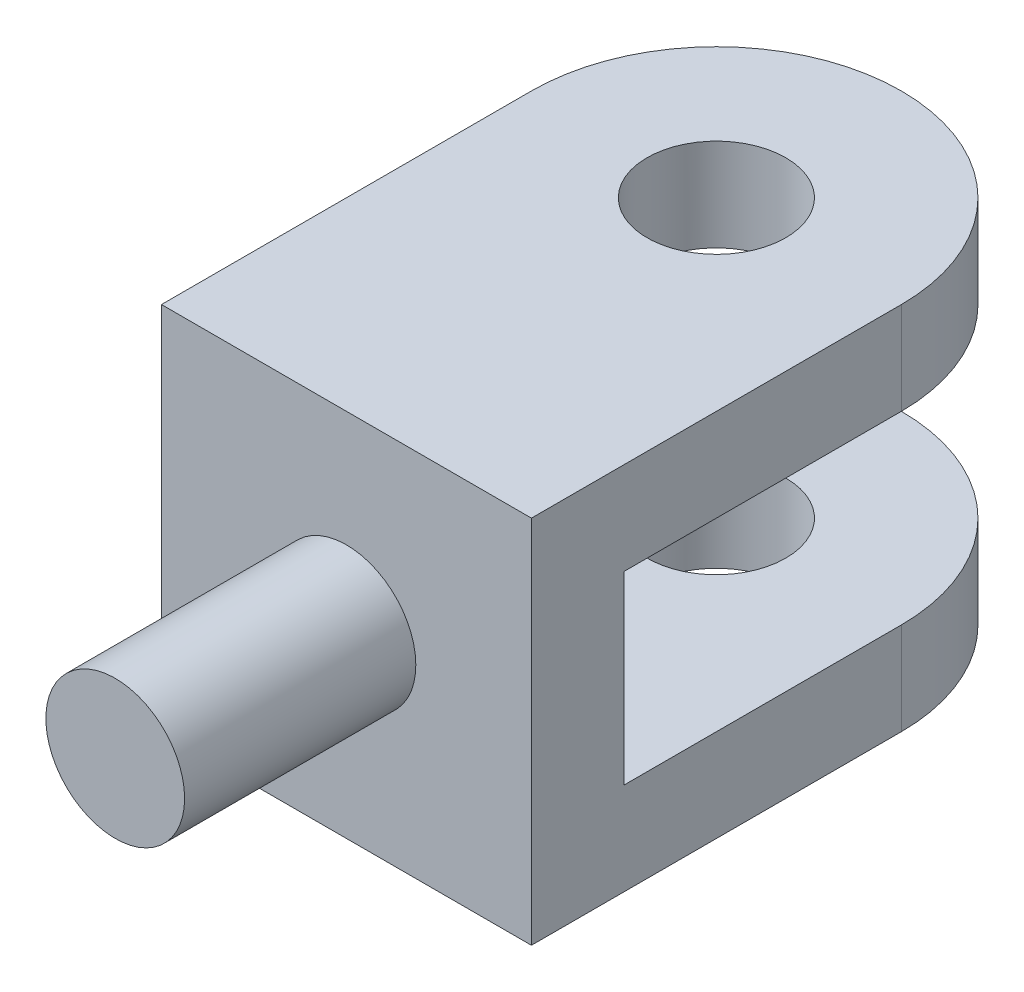
ISO-10303-21;
HEADER;
FILE_DESCRIPTION(('STEP AP214'),'2;1');
FILE_NAME('part.step','',(''),(''),'','','');
FILE_SCHEMA(('AUTOMOTIVE_DESIGN { 1 0 10303 214 1 1 1 1 }'));
ENDSEC;
DATA;
#1=APPLICATION_CONTEXT('core data for automotive mechanical design processes');
#2=APPLICATION_PROTOCOL_DEFINITION('international standard','automotive_design',2000,#1);
#3=PRODUCT_CONTEXT('',#1,'mechanical');
#4=PRODUCT('Part','Part','',(#3));
#5=PRODUCT_RELATED_PRODUCT_CATEGORY('part','',(#4));
#6=PRODUCT_DEFINITION_FORMATION('','',#4);
#7=PRODUCT_DEFINITION_CONTEXT('part definition',#1,'design');
#8=PRODUCT_DEFINITION('design','',#6,#7);
#9=PRODUCT_DEFINITION_SHAPE('','',#8);
#10=(LENGTH_UNIT() NAMED_UNIT(*) SI_UNIT(.MILLI.,.METRE.));
#11=(NAMED_UNIT(*) PLANE_ANGLE_UNIT() SI_UNIT($,.RADIAN.));
#12=(NAMED_UNIT(*) SI_UNIT($,.STERADIAN.) SOLID_ANGLE_UNIT());
#13=UNCERTAINTY_MEASURE_WITH_UNIT(LENGTH_MEASURE(1.E-05),#10,'distance_accuracy_value','');
#14=(GEOMETRIC_REPRESENTATION_CONTEXT(3) GLOBAL_UNCERTAINTY_ASSIGNED_CONTEXT((#13)) GLOBAL_UNIT_ASSIGNED_CONTEXT((#10,
#11,#12)) REPRESENTATION_CONTEXT('',''));
#15=CARTESIAN_POINT('',(0.,0.,0.));
#16=DIRECTION('',(0.,0.,1.));
#17=DIRECTION('',(1.,0.,0.));
#18=AXIS2_PLACEMENT_3D('',#15,#16,#17);
#19=CARTESIAN_POINT('',(8.,8.,24.));
#20=DIRECTION('',(-1.,0.,0.));
#21=DIRECTION('',(0.,-1.,0.));
#22=AXIS2_PLACEMENT_3D('',#19,#20,#21);
#23=PLANE('',#22);
#24=DIRECTION('',(0.,0.,-1.));
#25=VECTOR('',#24,1.);
#26=CARTESIAN_POINT('',(8.,4.,20.));
#27=LINE('',#26,#25);
#28=CARTESIAN_POINT('',(8.,4.,20.));
#29=VERTEX_POINT('',#28);
#30=CARTESIAN_POINT('',(8.00000000000001,4.,8.));
#31=VERTEX_POINT('',#30);
#32=EDGE_CURVE('E131',#29,#31,#27,.T.);
#33=ORIENTED_EDGE('',*,*,#32,.T.);
#34=DIRECTION('',(0.,1.,0.));
#35=VECTOR('',#34,1.);
#36=CARTESIAN_POINT('',(8.,8.,8.));
#37=LINE('',#36,#35);
#38=CARTESIAN_POINT('',(8.,8.,8.));
#39=VERTEX_POINT('',#38);
#40=EDGE_CURVE('E196',#31,#39,#37,.T.);
#41=ORIENTED_EDGE('',*,*,#40,.T.);
#42=DIRECTION('',(0.,0.,-1.));
#43=VECTOR('',#42,1.);
#44=CARTESIAN_POINT('',(8.,8.,24.));
#45=LINE('',#44,#43);
#46=CARTESIAN_POINT('',(8.,8.,24.));
#47=VERTEX_POINT('',#46);
#48=EDGE_CURVE('E160',#47,#39,#45,.T.);
#49=ORIENTED_EDGE('',*,*,#48,.F.);
#50=DIRECTION('',(0.,1.,0.));
#51=VECTOR('',#50,1.);
#52=CARTESIAN_POINT('',(8.,8.,24.));
#53=LINE('',#52,#51);
#54=CARTESIAN_POINT('',(8.,-8.,24.));
#55=VERTEX_POINT('',#54);
#56=EDGE_CURVE('E155',#55,#47,#53,.T.);
#57=ORIENTED_EDGE('',*,*,#56,.F.);
#58=DIRECTION('',(0.,0.,-1.));
#59=VECTOR('',#58,1.);
#60=CARTESIAN_POINT('',(8.,-8.,24.));
#61=LINE('',#60,#59);
#62=CARTESIAN_POINT('',(8.,-8.,8.));
#63=VERTEX_POINT('',#62);
#64=EDGE_CURVE('E169',#55,#63,#61,.T.);
#65=ORIENTED_EDGE('',*,*,#64,.T.);
#66=DIRECTION('',(0.,1.,0.));
#67=VECTOR('',#66,1.);
#68=CARTESIAN_POINT('',(8.,8.,8.));
#69=LINE('',#68,#67);
#70=CARTESIAN_POINT('',(8.00000000000001,-4.,8.));
#71=VERTEX_POINT('',#70);
#72=EDGE_CURVE('E194',#63,#71,#69,.T.);
#73=ORIENTED_EDGE('',*,*,#72,.T.);
#74=DIRECTION('',(0.,0.,1.));
#75=VECTOR('',#74,1.);
#76=CARTESIAN_POINT('',(8.00000000000001,-4.,20.));
#77=LINE('',#76,#75);
#78=CARTESIAN_POINT('',(8.00000000000001,-4.,20.));
#79=VERTEX_POINT('',#78);
#80=EDGE_CURVE('E128',#71,#79,#77,.T.);
#81=ORIENTED_EDGE('',*,*,#80,.T.);
#82=DIRECTION('',(0.,1.,0.));
#83=VECTOR('',#82,1.);
#84=CARTESIAN_POINT('',(8.,4.,20.));
#85=LINE('',#84,#83);
#86=EDGE_CURVE('E121',#79,#29,#85,.T.);
#87=ORIENTED_EDGE('',*,*,#86,.T.);
#88=EDGE_LOOP('',(#33,#41,#49,#57,#65,#73,#81,#87));
#89=FACE_BOUND('',#88,.T.);
#90=ADVANCED_FACE('F38',(#89),#23,.F.);
#91=CARTESIAN_POINT('',(-8.,8.,24.));
#92=DIRECTION('',(0.,-1.,0.));
#93=DIRECTION('',(0.,0.,-1.));
#94=AXIS2_PLACEMENT_3D('',#91,#92,#93);
#95=PLANE('',#94);
#96=CARTESIAN_POINT('',(0.,8.,8.));
#97=DIRECTION('',(0.,-1.,0.));
#98=DIRECTION('',(0.,0.,-1.));
#99=AXIS2_PLACEMENT_3D('',#96,#97,#98);
#100=CIRCLE('',#99,3.);
#101=CARTESIAN_POINT('',(0.,8.,5.));
#102=VERTEX_POINT('',#101);
#103=EDGE_CURVE('E182',#102,#102,#100,.T.);
#104=ORIENTED_EDGE('',*,*,#103,.T.);
#105=EDGE_LOOP('',(#104));
#106=FACE_BOUND('',#105,.T.);
#107=CARTESIAN_POINT('',(0.,8.,8.));
#108=DIRECTION('',(0.,-1.,0.));
#109=DIRECTION('',(0.,0.,-1.));
#110=AXIS2_PLACEMENT_3D('',#107,#108,#109);
#111=CIRCLE('',#110,8.);
#112=CARTESIAN_POINT('',(0.,8.,0.));
#113=VERTEX_POINT('',#112);
#114=EDGE_CURVE('E190',#39,#113,#111,.F.);
#115=ORIENTED_EDGE('',*,*,#114,.T.);
#116=CARTESIAN_POINT('',(0.,8.,8.));
#117=DIRECTION('',(0.,-1.,0.));
#118=DIRECTION('',(0.,0.,-1.));
#119=AXIS2_PLACEMENT_3D('',#116,#117,#118);
#120=CIRCLE('',#119,8.);
#121=CARTESIAN_POINT('',(-8.,8.,8.));
#122=VERTEX_POINT('',#121);
#123=EDGE_CURVE('E192',#113,#122,#120,.F.);
#124=ORIENTED_EDGE('',*,*,#123,.T.);
#125=DIRECTION('',(0.,0.,-1.));
#126=VECTOR('',#125,1.);
#127=CARTESIAN_POINT('',(-8.,8.,24.));
#128=LINE('',#127,#126);
#129=CARTESIAN_POINT('',(-8.,8.,24.));
#130=VERTEX_POINT('',#129);
#131=EDGE_CURVE('E174',#130,#122,#128,.T.);
#132=ORIENTED_EDGE('',*,*,#131,.F.);
#133=DIRECTION('',(-1.,0.,0.));
#134=VECTOR('',#133,1.);
#135=CARTESIAN_POINT('',(-8.,8.,24.));
#136=LINE('',#135,#134);
#137=EDGE_CURVE('E163',#47,#130,#136,.T.);
#138=ORIENTED_EDGE('',*,*,#137,.F.);
#139=ORIENTED_EDGE('',*,*,#48,.T.);
#140=EDGE_LOOP('',(#115,#124,#132,#138,#139));
#141=FACE_BOUND('',#140,.T.);
#142=ADVANCED_FACE('F227',(#106,#141),#95,.F.);
#143=CARTESIAN_POINT('',(-8.,8.,24.));
#144=DIRECTION('',(1.,0.,0.));
#145=DIRECTION('',(0.,1.,0.));
#146=AXIS2_PLACEMENT_3D('',#143,#144,#145);
#147=PLANE('',#146);
#148=ORIENTED_EDGE('',*,*,#131,.T.);
#149=DIRECTION('',(0.,-1.,0.));
#150=VECTOR('',#149,1.);
#151=CARTESIAN_POINT('',(-8.,8.,8.));
#152=LINE('',#151,#150);
#153=CARTESIAN_POINT('',(-8.,4.,8.));
#154=VERTEX_POINT('',#153);
#155=EDGE_CURVE('E184',#122,#154,#152,.T.);
#156=ORIENTED_EDGE('',*,*,#155,.T.);
#157=DIRECTION('',(0.,0.,-1.));
#158=VECTOR('',#157,1.);
#159=CARTESIAN_POINT('',(-8.,4.,20.));
#160=LINE('',#159,#158);
#161=CARTESIAN_POINT('',(-8.,4.,20.));
#162=VERTEX_POINT('',#161);
#163=EDGE_CURVE('E142',#162,#154,#160,.T.);
#164=ORIENTED_EDGE('',*,*,#163,.F.);
#165=DIRECTION('',(0.,1.,0.));
#166=VECTOR('',#165,1.);
#167=CARTESIAN_POINT('',(-8.,4.,20.));
#168=LINE('',#167,#166);
#169=CARTESIAN_POINT('',(-8.,-4.,20.));
#170=VERTEX_POINT('',#169);
#171=EDGE_CURVE('E123',#170,#162,#168,.T.);
#172=ORIENTED_EDGE('',*,*,#171,.F.);
#173=DIRECTION('',(0.,0.,1.));
#174=VECTOR('',#173,1.);
#175=CARTESIAN_POINT('',(-8.,-4.,20.));
#176=LINE('',#175,#174);
#177=CARTESIAN_POINT('',(-8.,-4.,8.));
#178=VERTEX_POINT('',#177);
#179=EDGE_CURVE('E140',#178,#170,#176,.T.);
#180=ORIENTED_EDGE('',*,*,#179,.F.);
#181=DIRECTION('',(0.,-1.,0.));
#182=VECTOR('',#181,1.);
#183=CARTESIAN_POINT('',(-8.,8.,8.));
#184=LINE('',#183,#182);
#185=CARTESIAN_POINT('',(-8.,-8.,8.));
#186=VERTEX_POINT('',#185);
#187=EDGE_CURVE('E159',#178,#186,#184,.T.);
#188=ORIENTED_EDGE('',*,*,#187,.T.);
#189=DIRECTION('',(0.,0.,-1.));
#190=VECTOR('',#189,1.);
#191=CARTESIAN_POINT('',(-8.,-8.,24.));
#192=LINE('',#191,#190);
#193=CARTESIAN_POINT('',(-8.,-8.,24.));
#194=VERTEX_POINT('',#193);
#195=EDGE_CURVE('E172',#194,#186,#192,.T.);
#196=ORIENTED_EDGE('',*,*,#195,.F.);
#197=DIRECTION('',(0.,-1.,0.));
#198=VECTOR('',#197,1.);
#199=CARTESIAN_POINT('',(-8.,8.,24.));
#200=LINE('',#199,#198);
#201=EDGE_CURVE('E165',#130,#194,#200,.T.);
#202=ORIENTED_EDGE('',*,*,#201,.F.);
#203=EDGE_LOOP('',(#148,#156,#164,#172,#180,#188,#196,#202));
#204=FACE_BOUND('',#203,.T.);
#205=ADVANCED_FACE('F218',(#204),#147,.F.);
#206=CARTESIAN_POINT('',(-8.,-8.,24.));
#207=DIRECTION('',(0.,1.,0.));
#208=DIRECTION('',(0.,0.,1.));
#209=AXIS2_PLACEMENT_3D('',#206,#207,#208);
#210=PLANE('',#209);
#211=CARTESIAN_POINT('',(0.,-8.,8.));
#212=DIRECTION('',(0.,-1.,0.));
#213=DIRECTION('',(0.,0.,-1.));
#214=AXIS2_PLACEMENT_3D('',#211,#212,#213);
#215=CIRCLE('',#214,3.);
#216=CARTESIAN_POINT('',(0.,-8.,5.));
#217=VERTEX_POINT('',#216);
#218=EDGE_CURVE('E203',#217,#217,#215,.T.);
#219=ORIENTED_EDGE('',*,*,#218,.F.);
#220=EDGE_LOOP('',(#219));
#221=FACE_BOUND('',#220,.T.);
#222=CARTESIAN_POINT('',(0.,-8.,8.));
#223=DIRECTION('',(0.,1.,0.));
#224=DIRECTION('',(0.,0.,1.));
#225=AXIS2_PLACEMENT_3D('',#222,#223,#224);
#226=CIRCLE('',#225,8.);
#227=CARTESIAN_POINT('',(0.,-8.,0.));
#228=VERTEX_POINT('',#227);
#229=EDGE_CURVE('E47',#186,#228,#226,.F.);
#230=ORIENTED_EDGE('',*,*,#229,.T.);
#231=CARTESIAN_POINT('',(0.,-8.,8.));
#232=DIRECTION('',(0.,1.,0.));
#233=DIRECTION('',(0.,0.,1.));
#234=AXIS2_PLACEMENT_3D('',#231,#232,#233);
#235=CIRCLE('',#234,8.);
#236=EDGE_CURVE('E11',#228,#63,#235,.F.);
#237=ORIENTED_EDGE('',*,*,#236,.T.);
#238=ORIENTED_EDGE('',*,*,#64,.F.);
#239=DIRECTION('',(1.,0.,0.));
#240=VECTOR('',#239,1.);
#241=CARTESIAN_POINT('',(-8.,-8.,24.));
#242=LINE('',#241,#240);
#243=EDGE_CURVE('E167',#194,#55,#242,.T.);
#244=ORIENTED_EDGE('',*,*,#243,.F.);
#245=ORIENTED_EDGE('',*,*,#195,.T.);
#246=EDGE_LOOP('',(#230,#237,#238,#244,#245));
#247=FACE_BOUND('',#246,.T.);
#248=ADVANCED_FACE('F234',(#221,#247),#210,.F.);
#249=CARTESIAN_POINT('',(0.,0.,24.));
#250=DIRECTION('',(0.,0.,1.));
#251=DIRECTION('',(1.,0.,0.));
#252=AXIS2_PLACEMENT_3D('',#249,#250,#251);
#253=PLANE('',#252);
#254=CARTESIAN_POINT('',(0.,0.,24.));
#255=DIRECTION('',(0.,0.,1.));
#256=DIRECTION('',(1.,0.,0.));
#257=AXIS2_PLACEMENT_3D('',#254,#255,#256);
#258=CIRCLE('',#257,3.);
#259=CARTESIAN_POINT('',(3.,0.,24.));
#260=VERTEX_POINT('',#259);
#261=EDGE_CURVE('E156',#260,#260,#258,.T.);
#262=ORIENTED_EDGE('',*,*,#261,.F.);
#263=EDGE_LOOP('',(#262));
#264=FACE_BOUND('',#263,.T.);
#265=ORIENTED_EDGE('',*,*,#56,.T.);
#266=ORIENTED_EDGE('',*,*,#137,.T.);
#267=ORIENTED_EDGE('',*,*,#201,.T.);
#268=ORIENTED_EDGE('',*,*,#243,.T.);
#269=EDGE_LOOP('',(#265,#266,#267,#268));
#270=FACE_BOUND('',#269,.T.);
#271=ADVANCED_FACE('F231',(#264,#270),#253,.T.);
#272=CARTESIAN_POINT('',(0.,0.,34.));
#273=DIRECTION('',(0.,0.,-1.));
#274=DIRECTION('',(-1.,0.,0.));
#275=AXIS2_PLACEMENT_3D('',#272,#273,#274);
#276=CYLINDRICAL_SURFACE('',#275,3.);
#277=CARTESIAN_POINT('',(0.,0.,34.));
#278=DIRECTION('',(0.,0.,1.));
#279=DIRECTION('',(1.,0.,0.));
#280=AXIS2_PLACEMENT_3D('',#277,#278,#279);
#281=CIRCLE('',#280,3.);
#282=CARTESIAN_POINT('',(3.,0.,34.));
#283=VERTEX_POINT('',#282);
#284=EDGE_CURVE('E151',#283,#283,#281,.T.);
#285=ORIENTED_EDGE('',*,*,#284,.F.);
#286=EDGE_LOOP('',(#285));
#287=FACE_BOUND('',#286,.T.);
#288=ORIENTED_EDGE('',*,*,#261,.T.);
#289=EDGE_LOOP('',(#288));
#290=FACE_BOUND('',#289,.T.);
#291=ADVANCED_FACE('F259',(#287,#290),#276,.T.);
#292=CARTESIAN_POINT('',(0.,0.,34.));
#293=DIRECTION('',(0.,0.,1.));
#294=DIRECTION('',(1.,0.,0.));
#295=AXIS2_PLACEMENT_3D('',#292,#293,#294);
#296=PLANE('',#295);
#297=ORIENTED_EDGE('',*,*,#284,.T.);
#298=EDGE_LOOP('',(#297));
#299=FACE_BOUND('',#298,.T.);
#300=ADVANCED_FACE('F263',(#299),#296,.T.);
#301=CARTESIAN_POINT('',(8.,4.,20.));
#302=DIRECTION('',(0.,0.,1.));
#303=DIRECTION('',(1.,0.,0.));
#304=AXIS2_PLACEMENT_3D('',#301,#302,#303);
#305=PLANE('',#304);
#306=ORIENTED_EDGE('',*,*,#171,.T.);
#307=DIRECTION('',(-1.,0.,0.));
#308=VECTOR('',#307,1.);
#309=CARTESIAN_POINT('',(8.,4.,20.));
#310=LINE('',#309,#308);
#311=EDGE_CURVE('E116',#29,#162,#310,.T.);
#312=ORIENTED_EDGE('',*,*,#311,.F.);
#313=ORIENTED_EDGE('',*,*,#86,.F.);
#314=DIRECTION('',(-1.,0.,0.));
#315=VECTOR('',#314,1.);
#316=CARTESIAN_POINT('',(8.00000000000001,-4.,20.));
#317=LINE('',#316,#315);
#318=EDGE_CURVE('E127',#79,#170,#317,.T.);
#319=ORIENTED_EDGE('',*,*,#318,.T.);
#320=EDGE_LOOP('',(#306,#312,#313,#319));
#321=FACE_BOUND('',#320,.T.);
#322=ADVANCED_FACE('F118',(#321),#305,.F.);
#323=CARTESIAN_POINT('',(8.00000000000001,-4.,20.));
#324=DIRECTION('',(0.,-1.,0.));
#325=DIRECTION('',(1.,0.,0.));
#326=AXIS2_PLACEMENT_3D('',#323,#324,#325);
#327=PLANE('',#326);
#328=CARTESIAN_POINT('',(0.,-4.,8.));
#329=DIRECTION('',(0.,-1.,0.));
#330=DIRECTION('',(1.,0.,0.));
#331=AXIS2_PLACEMENT_3D('',#328,#329,#330);
#332=CIRCLE('',#331,3.);
#333=CARTESIAN_POINT('',(3.,-4.,8.));
#334=VERTEX_POINT('',#333);
#335=EDGE_CURVE('E145',#334,#334,#332,.T.);
#336=ORIENTED_EDGE('',*,*,#335,.T.);
#337=EDGE_LOOP('',(#336));
#338=FACE_BOUND('',#337,.T.);
#339=ORIENTED_EDGE('',*,*,#80,.F.);
#340=CARTESIAN_POINT('',(0.,-4.,8.));
#341=DIRECTION('',(0.,-1.,0.));
#342=DIRECTION('',(1.,0.,0.));
#343=AXIS2_PLACEMENT_3D('',#340,#341,#342);
#344=CIRCLE('',#343,8.);
#345=CARTESIAN_POINT('',(0.,-4.,0.));
#346=VERTEX_POINT('',#345);
#347=EDGE_CURVE('E61',#71,#346,#344,.F.);
#348=ORIENTED_EDGE('',*,*,#347,.T.);
#349=CARTESIAN_POINT('',(0.,-4.,8.));
#350=DIRECTION('',(0.,-1.,0.));
#351=DIRECTION('',(1.,0.,0.));
#352=AXIS2_PLACEMENT_3D('',#349,#350,#351);
#353=CIRCLE('',#352,8.);
#354=EDGE_CURVE('E198',#346,#178,#353,.F.);
#355=ORIENTED_EDGE('',*,*,#354,.T.);
#356=ORIENTED_EDGE('',*,*,#179,.T.);
#357=ORIENTED_EDGE('',*,*,#318,.F.);
#358=EDGE_LOOP('',(#339,#348,#355,#356,#357));
#359=FACE_BOUND('',#358,.T.);
#360=ADVANCED_FACE('F216',(#338,#359),#327,.F.);
#361=CARTESIAN_POINT('',(8.,4.,20.));
#362=DIRECTION('',(0.,1.,0.));
#363=DIRECTION('',(-1.,0.,0.));
#364=AXIS2_PLACEMENT_3D('',#361,#362,#363);
#365=PLANE('',#364);
#366=CARTESIAN_POINT('',(0.,4.,8.));
#367=DIRECTION('',(0.,1.,0.));
#368=DIRECTION('',(-1.,0.,0.));
#369=AXIS2_PLACEMENT_3D('',#366,#367,#368);
#370=CIRCLE('',#369,3.);
#371=CARTESIAN_POINT('',(-3.,4.,8.));
#372=VERTEX_POINT('',#371);
#373=EDGE_CURVE('E179',#372,#372,#370,.T.);
#374=ORIENTED_EDGE('',*,*,#373,.T.);
#375=EDGE_LOOP('',(#374));
#376=FACE_BOUND('',#375,.T.);
#377=ORIENTED_EDGE('',*,*,#163,.T.);
#378=CARTESIAN_POINT('',(0.,4.,8.));
#379=DIRECTION('',(0.,1.,0.));
#380=DIRECTION('',(-1.,0.,0.));
#381=AXIS2_PLACEMENT_3D('',#378,#379,#380);
#382=CIRCLE('',#381,8.);
#383=CARTESIAN_POINT('',(0.,4.,0.));
#384=VERTEX_POINT('',#383);
#385=EDGE_CURVE('E188',#154,#384,#382,.F.);
#386=ORIENTED_EDGE('',*,*,#385,.T.);
#387=CARTESIAN_POINT('',(0.,4.,8.));
#388=DIRECTION('',(0.,1.,0.));
#389=DIRECTION('',(-1.,0.,0.));
#390=AXIS2_PLACEMENT_3D('',#387,#388,#389);
#391=CIRCLE('',#390,8.);
#392=EDGE_CURVE('E134',#384,#31,#391,.F.);
#393=ORIENTED_EDGE('',*,*,#392,.T.);
#394=ORIENTED_EDGE('',*,*,#32,.F.);
#395=ORIENTED_EDGE('',*,*,#311,.T.);
#396=EDGE_LOOP('',(#377,#386,#393,#394,#395));
#397=FACE_BOUND('',#396,.T.);
#398=ADVANCED_FACE('F132',(#376,#397),#365,.F.);
#399=CARTESIAN_POINT('',(0.,8.,8.));
#400=DIRECTION('',(0.,-1.,0.));
#401=DIRECTION('',(0.,0.,-1.));
#402=AXIS2_PLACEMENT_3D('',#399,#400,#401);
#403=CYLINDRICAL_SURFACE('',#402,3.);
#404=ORIENTED_EDGE('',*,*,#103,.F.);
#405=EDGE_LOOP('',(#404));
#406=FACE_BOUND('',#405,.T.);
#407=ORIENTED_EDGE('',*,*,#373,.F.);
#408=EDGE_LOOP('',(#407));
#409=FACE_BOUND('',#408,.T.);
#410=ADVANCED_FACE('F272',(#406,#409),#403,.F.);
#411=ORIENTED_EDGE('',*,*,#218,.T.);
#412=EDGE_LOOP('',(#411));
#413=FACE_BOUND('',#412,.T.);
#414=ORIENTED_EDGE('',*,*,#335,.F.);
#415=EDGE_LOOP('',(#414));
#416=FACE_BOUND('',#415,.T.);
#417=ADVANCED_FACE('F242',(#413,#416),#403,.F.);
#418=CARTESIAN_POINT('',(0.,8.,8.));
#419=DIRECTION('',(0.,1.,0.));
#420=DIRECTION('',(-1.,0.,0.));
#421=AXIS2_PLACEMENT_3D('',#418,#419,#420);
#422=CYLINDRICAL_SURFACE('',#421,8.);
#423=DIRECTION('',(0.,1.,0.));
#424=VECTOR('',#423,1.);
#425=CARTESIAN_POINT('',(0.,0.,0.));
#426=LINE('',#425,#424);
#427=EDGE_CURVE('E201',#113,#384,#426,.F.);
#428=ORIENTED_EDGE('',*,*,#427,.F.);
#429=ORIENTED_EDGE('',*,*,#114,.F.);
#430=ORIENTED_EDGE('',*,*,#40,.F.);
#431=ORIENTED_EDGE('',*,*,#392,.F.);
#432=EDGE_LOOP('',(#428,#429,#430,#431));
#433=FACE_BOUND('',#432,.T.);
#434=ADVANCED_FACE('F222',(#433),#422,.T.);
#435=CARTESIAN_POINT('',(0.,8.,8.));
#436=DIRECTION('',(0.,-1.,0.));
#437=DIRECTION('',(1.,0.,0.));
#438=AXIS2_PLACEMENT_3D('',#435,#436,#437);
#439=CYLINDRICAL_SURFACE('',#438,8.);
#440=ORIENTED_EDGE('',*,*,#123,.F.);
#441=ORIENTED_EDGE('',*,*,#427,.T.);
#442=ORIENTED_EDGE('',*,*,#385,.F.);
#443=ORIENTED_EDGE('',*,*,#155,.F.);
#444=EDGE_LOOP('',(#440,#441,#442,#443));
#445=FACE_BOUND('',#444,.T.);
#446=ADVANCED_FACE('F235',(#445),#439,.T.);
#447=CARTESIAN_POINT('',(0.,8.,8.));
#448=DIRECTION('',(0.,-1.,0.));
#449=DIRECTION('',(1.,0.,0.));
#450=AXIS2_PLACEMENT_3D('',#447,#448,#449);
#451=CYLINDRICAL_SURFACE('',#450,8.);
#452=DIRECTION('',(0.,-1.,0.));
#453=VECTOR('',#452,1.);
#454=CARTESIAN_POINT('',(0.,0.,0.));
#455=LINE('',#454,#453);
#456=EDGE_CURVE('E42',#228,#346,#455,.F.);
#457=ORIENTED_EDGE('',*,*,#456,.F.);
#458=ORIENTED_EDGE('',*,*,#229,.F.);
#459=ORIENTED_EDGE('',*,*,#187,.F.);
#460=ORIENTED_EDGE('',*,*,#354,.F.);
#461=EDGE_LOOP('',(#457,#458,#459,#460));
#462=FACE_BOUND('',#461,.T.);
#463=ADVANCED_FACE('F40',(#462),#451,.T.);
#464=CARTESIAN_POINT('',(0.,8.,8.));
#465=DIRECTION('',(0.,1.,0.));
#466=DIRECTION('',(-1.,0.,0.));
#467=AXIS2_PLACEMENT_3D('',#464,#465,#466);
#468=CYLINDRICAL_SURFACE('',#467,8.);
#469=ORIENTED_EDGE('',*,*,#236,.F.);
#470=ORIENTED_EDGE('',*,*,#456,.T.);
#471=ORIENTED_EDGE('',*,*,#347,.F.);
#472=ORIENTED_EDGE('',*,*,#72,.F.);
#473=EDGE_LOOP('',(#469,#470,#471,#472));
#474=FACE_BOUND('',#473,.T.);
#475=ADVANCED_FACE('F211',(#474),#468,.T.);
#476=CLOSED_SHELL('',(#90,#142,#205,#248,#271,#291,#300,#322,#360,#398,#410,#417,#434,#446,#463,#475));
#477=MANIFOLD_SOLID_BREP('B2',#476);
#478=ADVANCED_BREP_SHAPE_REPRESENTATION('',(#18,#477),#14);
#479=SHAPE_DEFINITION_REPRESENTATION(#9,#478);
ENDSEC;
END-ISO-10303-21;
